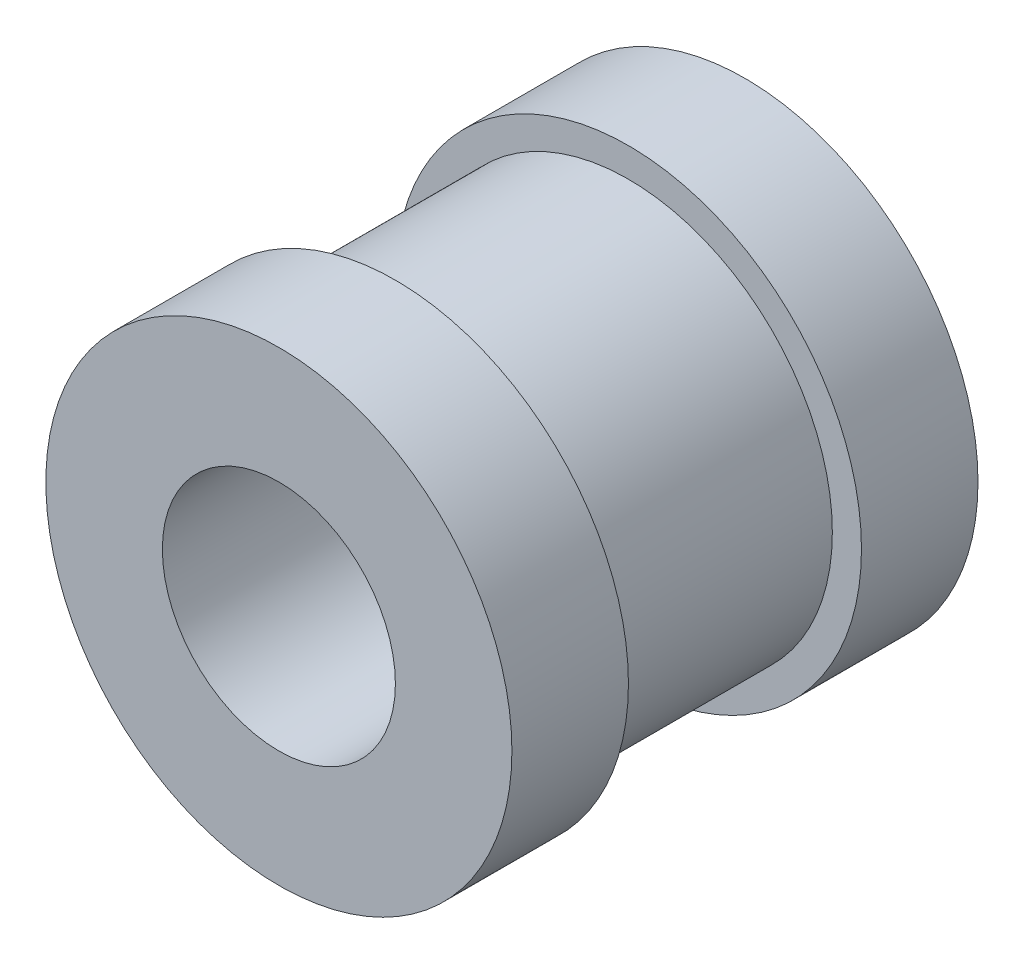
ISO-10303-21;
HEADER;
FILE_DESCRIPTION(('STEP AP214'),'2;1');
FILE_NAME('part.step','',(''),(''),'','','');
FILE_SCHEMA(('AUTOMOTIVE_DESIGN { 1 0 10303 214 1 1 1 1 }'));
ENDSEC;
DATA;
#1=APPLICATION_CONTEXT('core data for automotive mechanical design processes');
#2=APPLICATION_PROTOCOL_DEFINITION('international standard','automotive_design',2000,#1);
#3=PRODUCT_CONTEXT('',#1,'mechanical');
#4=PRODUCT('Part','Part','',(#3));
#5=PRODUCT_RELATED_PRODUCT_CATEGORY('part','',(#4));
#6=PRODUCT_DEFINITION_FORMATION('','',#4);
#7=PRODUCT_DEFINITION_CONTEXT('part definition',#1,'design');
#8=PRODUCT_DEFINITION('design','',#6,#7);
#9=PRODUCT_DEFINITION_SHAPE('','',#8);
#10=(LENGTH_UNIT() NAMED_UNIT(*) SI_UNIT(.MILLI.,.METRE.));
#11=(NAMED_UNIT(*) PLANE_ANGLE_UNIT() SI_UNIT($,.RADIAN.));
#12=(NAMED_UNIT(*) SI_UNIT($,.STERADIAN.) SOLID_ANGLE_UNIT());
#13=UNCERTAINTY_MEASURE_WITH_UNIT(LENGTH_MEASURE(1.E-05),#10,'distance_accuracy_value','');
#14=(GEOMETRIC_REPRESENTATION_CONTEXT(3) GLOBAL_UNCERTAINTY_ASSIGNED_CONTEXT((#13)) GLOBAL_UNIT_ASSIGNED_CONTEXT((#10,
#11,#12)) REPRESENTATION_CONTEXT('',''));
#15=CARTESIAN_POINT('',(0.,0.,0.));
#16=DIRECTION('',(0.,0.,1.));
#17=DIRECTION('',(1.,0.,0.));
#18=AXIS2_PLACEMENT_3D('',#15,#16,#17);
#19=CARTESIAN_POINT('',(0.,0.,5.));
#20=DIRECTION('',(0.,0.,-1.));
#21=DIRECTION('',(-1.,0.,0.));
#22=AXIS2_PLACEMENT_3D('',#19,#20,#21);
#23=CYLINDRICAL_SURFACE('',#22,10.);
#24=CARTESIAN_POINT('',(0.,0.,5.));
#25=DIRECTION('',(0.,0.,1.));
#26=DIRECTION('',(1.,0.,0.));
#27=AXIS2_PLACEMENT_3D('',#24,#25,#26);
#28=CIRCLE('',#27,10.);
#29=CARTESIAN_POINT('',(10.,0.,5.));
#30=VERTEX_POINT('',#29);
#31=EDGE_CURVE('E41',#30,#30,#28,.T.);
#32=ORIENTED_EDGE('',*,*,#31,.F.);
#33=EDGE_LOOP('',(#32));
#34=FACE_BOUND('',#33,.T.);
#35=CARTESIAN_POINT('',(0.,0.,0.));
#36=DIRECTION('',(0.,0.,1.));
#37=DIRECTION('',(1.,0.,0.));
#38=AXIS2_PLACEMENT_3D('',#35,#36,#37);
#39=CIRCLE('',#38,10.);
#40=CARTESIAN_POINT('',(10.,0.,0.));
#41=VERTEX_POINT('',#40);
#42=EDGE_CURVE('E37',#41,#41,#39,.T.);
#43=ORIENTED_EDGE('',*,*,#42,.T.);
#44=EDGE_LOOP('',(#43));
#45=FACE_BOUND('',#44,.T.);
#46=ADVANCED_FACE('F34',(#34,#45),#23,.T.);
#47=CARTESIAN_POINT('',(0.,0.,5.));
#48=DIRECTION('',(0.,0.,1.));
#49=DIRECTION('',(1.,0.,0.));
#50=AXIS2_PLACEMENT_3D('',#47,#48,#49);
#51=PLANE('',#50);
#52=CARTESIAN_POINT('',(0.,0.,5.));
#53=DIRECTION('',(0.,0.,1.));
#54=DIRECTION('',(1.,0.,0.));
#55=AXIS2_PLACEMENT_3D('',#52,#53,#54);
#56=CIRCLE('',#55,8.75);
#57=CARTESIAN_POINT('',(8.75,0.,5.));
#58=VERTEX_POINT('',#57);
#59=EDGE_CURVE('E10',#58,#58,#56,.T.);
#60=ORIENTED_EDGE('',*,*,#59,.F.);
#61=EDGE_LOOP('',(#60));
#62=FACE_BOUND('',#61,.T.);
#63=ORIENTED_EDGE('',*,*,#31,.T.);
#64=EDGE_LOOP('',(#63));
#65=FACE_BOUND('',#64,.T.);
#66=ADVANCED_FACE('F93',(#62,#65),#51,.T.);
#67=CARTESIAN_POINT('',(0.,0.,0.));
#68=DIRECTION('',(0.,0.,1.));
#69=DIRECTION('',(1.,0.,0.));
#70=AXIS2_PLACEMENT_3D('',#67,#68,#69);
#71=PLANE('',#70);
#72=CARTESIAN_POINT('',(0.,0.,0.));
#73=DIRECTION('',(0.,0.,1.));
#74=DIRECTION('',(1.,0.,0.));
#75=AXIS2_PLACEMENT_3D('',#72,#73,#74);
#76=CIRCLE('',#75,5.);
#77=CARTESIAN_POINT('',(5.,0.,0.));
#78=VERTEX_POINT('',#77);
#79=EDGE_CURVE('E54',#78,#78,#76,.T.);
#80=ORIENTED_EDGE('',*,*,#79,.T.);
#81=EDGE_LOOP('',(#80));
#82=FACE_BOUND('',#81,.T.);
#83=ORIENTED_EDGE('',*,*,#42,.F.);
#84=EDGE_LOOP('',(#83));
#85=FACE_BOUND('',#84,.T.);
#86=ADVANCED_FACE('F63',(#82,#85),#71,.F.);
#87=CARTESIAN_POINT('',(0.,0.,15.));
#88=DIRECTION('',(0.,0.,-1.));
#89=DIRECTION('',(-1.,0.,0.));
#90=AXIS2_PLACEMENT_3D('',#87,#88,#89);
#91=CYLINDRICAL_SURFACE('',#90,8.75);
#92=CARTESIAN_POINT('',(0.,0.,15.));
#93=DIRECTION('',(0.,0.,1.));
#94=DIRECTION('',(1.,0.,0.));
#95=AXIS2_PLACEMENT_3D('',#92,#93,#94);
#96=CIRCLE('',#95,8.75);
#97=CARTESIAN_POINT('',(8.75,0.,15.));
#98=VERTEX_POINT('',#97);
#99=EDGE_CURVE('E47',#98,#98,#96,.T.);
#100=ORIENTED_EDGE('',*,*,#99,.F.);
#101=EDGE_LOOP('',(#100));
#102=FACE_BOUND('',#101,.T.);
#103=ORIENTED_EDGE('',*,*,#59,.T.);
#104=EDGE_LOOP('',(#103));
#105=FACE_BOUND('',#104,.T.);
#106=ADVANCED_FACE('F82',(#102,#105),#91,.T.);
#107=CARTESIAN_POINT('',(0.,0.,20.));
#108=DIRECTION('',(0.,0.,-1.));
#109=DIRECTION('',(-1.,0.,0.));
#110=AXIS2_PLACEMENT_3D('',#107,#108,#109);
#111=CYLINDRICAL_SURFACE('',#110,10.);
#112=CARTESIAN_POINT('',(0.,0.,20.));
#113=DIRECTION('',(0.,0.,1.));
#114=DIRECTION('',(1.,0.,0.));
#115=AXIS2_PLACEMENT_3D('',#112,#113,#114);
#116=CIRCLE('',#115,10.);
#117=CARTESIAN_POINT('',(10.,0.,20.));
#118=VERTEX_POINT('',#117);
#119=EDGE_CURVE('E50',#118,#118,#116,.T.);
#120=ORIENTED_EDGE('',*,*,#119,.F.);
#121=EDGE_LOOP('',(#120));
#122=FACE_BOUND('',#121,.T.);
#123=CARTESIAN_POINT('',(0.,0.,15.));
#124=DIRECTION('',(0.,0.,1.));
#125=DIRECTION('',(1.,0.,0.));
#126=AXIS2_PLACEMENT_3D('',#123,#124,#125);
#127=CIRCLE('',#126,10.);
#128=CARTESIAN_POINT('',(10.,0.,15.));
#129=VERTEX_POINT('',#128);
#130=EDGE_CURVE('E51',#129,#129,#127,.T.);
#131=ORIENTED_EDGE('',*,*,#130,.T.);
#132=EDGE_LOOP('',(#131));
#133=FACE_BOUND('',#132,.T.);
#134=ADVANCED_FACE('F76',(#122,#133),#111,.T.);
#135=CARTESIAN_POINT('',(0.,0.,20.));
#136=DIRECTION('',(0.,0.,1.));
#137=DIRECTION('',(1.,0.,0.));
#138=AXIS2_PLACEMENT_3D('',#135,#136,#137);
#139=PLANE('',#138);
#140=CARTESIAN_POINT('',(0.,0.,20.));
#141=DIRECTION('',(0.,0.,1.));
#142=DIRECTION('',(1.,0.,0.));
#143=AXIS2_PLACEMENT_3D('',#140,#141,#142);
#144=CIRCLE('',#143,5.);
#145=CARTESIAN_POINT('',(5.,0.,20.));
#146=VERTEX_POINT('',#145);
#147=EDGE_CURVE('E57',#146,#146,#144,.T.);
#148=ORIENTED_EDGE('',*,*,#147,.F.);
#149=EDGE_LOOP('',(#148));
#150=FACE_BOUND('',#149,.T.);
#151=ORIENTED_EDGE('',*,*,#119,.T.);
#152=EDGE_LOOP('',(#151));
#153=FACE_BOUND('',#152,.T.);
#154=ADVANCED_FACE('F73',(#150,#153),#139,.T.);
#155=CARTESIAN_POINT('',(0.,0.,15.));
#156=DIRECTION('',(0.,0.,1.));
#157=DIRECTION('',(1.,0.,0.));
#158=AXIS2_PLACEMENT_3D('',#155,#156,#157);
#159=PLANE('',#158);
#160=ORIENTED_EDGE('',*,*,#99,.T.);
#161=EDGE_LOOP('',(#160));
#162=FACE_BOUND('',#161,.T.);
#163=ORIENTED_EDGE('',*,*,#130,.F.);
#164=EDGE_LOOP('',(#163));
#165=FACE_BOUND('',#164,.T.);
#166=ADVANCED_FACE('F69',(#162,#165),#159,.F.);
#167=CARTESIAN_POINT('',(0.,0.,0.));
#168=DIRECTION('',(0.,0.,1.));
#169=DIRECTION('',(1.,0.,0.));
#170=AXIS2_PLACEMENT_3D('',#167,#168,#169);
#171=CYLINDRICAL_SURFACE('',#170,5.);
#172=ORIENTED_EDGE('',*,*,#79,.F.);
#173=EDGE_LOOP('',(#172));
#174=FACE_BOUND('',#173,.T.);
#175=ORIENTED_EDGE('',*,*,#147,.T.);
#176=EDGE_LOOP('',(#175));
#177=FACE_BOUND('',#176,.T.);
#178=ADVANCED_FACE('F66',(#174,#177),#171,.F.);
#179=CLOSED_SHELL('',(#46,#66,#86,#106,#134,#154,#166,#178));
#180=MANIFOLD_SOLID_BREP('B2',#179);
#181=ADVANCED_BREP_SHAPE_REPRESENTATION('',(#18,#180),#14);
#182=SHAPE_DEFINITION_REPRESENTATION(#9,#181);
ENDSEC;
END-ISO-10303-21;
